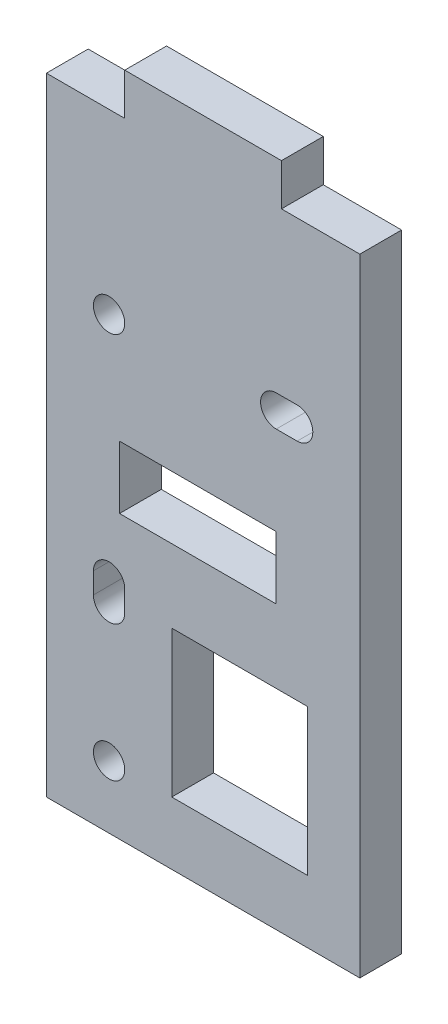
ISO-10303-21;
HEADER;
FILE_DESCRIPTION(('STEP AP214'),'2;1');
FILE_NAME('part.step','',(''),(''),'','','');
FILE_SCHEMA(('AUTOMOTIVE_DESIGN { 1 0 10303 214 1 1 1 1 }'));
ENDSEC;
DATA;
#1=APPLICATION_CONTEXT('core data for automotive mechanical design processes');
#2=APPLICATION_PROTOCOL_DEFINITION('international standard','automotive_design',2000,#1);
#3=PRODUCT_CONTEXT('',#1,'mechanical');
#4=PRODUCT('Part','Part','',(#3));
#5=PRODUCT_RELATED_PRODUCT_CATEGORY('part','',(#4));
#6=PRODUCT_DEFINITION_FORMATION('','',#4);
#7=PRODUCT_DEFINITION_CONTEXT('part definition',#1,'design');
#8=PRODUCT_DEFINITION('design','',#6,#7);
#9=PRODUCT_DEFINITION_SHAPE('','',#8);
#10=(LENGTH_UNIT() NAMED_UNIT(*) SI_UNIT(.MILLI.,.METRE.));
#11=(NAMED_UNIT(*) PLANE_ANGLE_UNIT() SI_UNIT($,.RADIAN.));
#12=(NAMED_UNIT(*) SI_UNIT($,.STERADIAN.) SOLID_ANGLE_UNIT());
#13=UNCERTAINTY_MEASURE_WITH_UNIT(LENGTH_MEASURE(1.E-05),#10,'distance_accuracy_value','');
#14=(GEOMETRIC_REPRESENTATION_CONTEXT(3) GLOBAL_UNCERTAINTY_ASSIGNED_CONTEXT((#13)) GLOBAL_UNIT_ASSIGNED_CONTEXT((#10,
#11,#12)) REPRESENTATION_CONTEXT('',''));
#15=CARTESIAN_POINT('',(0.,0.,0.));
#16=DIRECTION('',(0.,0.,1.));
#17=DIRECTION('',(1.,0.,0.));
#18=AXIS2_PLACEMENT_3D('',#15,#16,#17);
#19=CARTESIAN_POINT('',(0.,0.,4.));
#20=DIRECTION('',(0.,0.,-1.));
#21=DIRECTION('',(-1.,0.,0.));
#22=AXIS2_PLACEMENT_3D('',#19,#20,#21);
#23=PLANE('',#22);
#24=CARTESIAN_POINT('',(6.,21.,4.));
#25=DIRECTION('',(0.,0.,1.));
#26=DIRECTION('',(1.,0.,0.));
#27=AXIS2_PLACEMENT_3D('',#24,#25,#26);
#28=CIRCLE('',#27,1.5);
#29=CARTESIAN_POINT('',(7.5,21.,4.));
#30=VERTEX_POINT('',#29);
#31=CARTESIAN_POINT('',(4.5,21.,4.));
#32=VERTEX_POINT('',#31);
#33=EDGE_CURVE('E255',#30,#32,#28,.T.);
#34=ORIENTED_EDGE('',*,*,#33,.F.);
#35=DIRECTION('',(0.,1.,0.));
#36=VECTOR('',#35,1.);
#37=CARTESIAN_POINT('',(7.5,21.,4.));
#38=LINE('',#37,#36);
#39=CARTESIAN_POINT('',(7.5,19.,4.));
#40=VERTEX_POINT('',#39);
#41=EDGE_CURVE('E266',#40,#30,#38,.T.);
#42=ORIENTED_EDGE('',*,*,#41,.F.);
#43=CARTESIAN_POINT('',(6.,19.,4.));
#44=DIRECTION('',(0.,0.,1.));
#45=DIRECTION('',(1.,0.,0.));
#46=AXIS2_PLACEMENT_3D('',#43,#44,#45);
#47=CIRCLE('',#46,1.5);
#48=CARTESIAN_POINT('',(4.5,19.,4.));
#49=VERTEX_POINT('',#48);
#50=EDGE_CURVE('E262',#49,#40,#47,.T.);
#51=ORIENTED_EDGE('',*,*,#50,.F.);
#52=DIRECTION('',(0.,-1.,0.));
#53=VECTOR('',#52,1.);
#54=CARTESIAN_POINT('',(4.5,21.,4.));
#55=LINE('',#54,#53);
#56=EDGE_CURVE('E258',#32,#49,#55,.T.);
#57=ORIENTED_EDGE('',*,*,#56,.F.);
#58=EDGE_LOOP('',(#34,#42,#51,#57));
#59=FACE_BOUND('',#58,.T.);
#60=CARTESIAN_POINT('',(6.,43.,4.));
#61=DIRECTION('',(0.,0.,1.));
#62=DIRECTION('',(1.,0.,0.));
#63=AXIS2_PLACEMENT_3D('',#60,#61,#62);
#64=CIRCLE('',#63,1.5);
#65=CARTESIAN_POINT('',(7.5,43.,4.));
#66=VERTEX_POINT('',#65);
#67=EDGE_CURVE('E341',#66,#66,#64,.T.);
#68=ORIENTED_EDGE('',*,*,#67,.F.);
#69=EDGE_LOOP('',(#68));
#70=FACE_BOUND('',#69,.T.);
#71=CARTESIAN_POINT('',(6.,6.,4.));
#72=DIRECTION('',(0.,0.,1.));
#73=DIRECTION('',(1.,0.,0.));
#74=AXIS2_PLACEMENT_3D('',#71,#72,#73);
#75=CIRCLE('',#74,1.5);
#76=CARTESIAN_POINT('',(7.5,6.,4.));
#77=VERTEX_POINT('',#76);
#78=EDGE_CURVE('E349',#77,#77,#75,.T.);
#79=ORIENTED_EDGE('',*,*,#78,.F.);
#80=EDGE_LOOP('',(#79));
#81=FACE_BOUND('',#80,.T.);
#82=DIRECTION('',(0.,-1.,0.));
#83=VECTOR('',#82,1.);
#84=CARTESIAN_POINT('',(12.,20.,4.));
#85=LINE('',#84,#83);
#86=CARTESIAN_POINT('',(12.,20.,4.));
#87=VERTEX_POINT('',#86);
#88=CARTESIAN_POINT('',(12.,6.,4.));
#89=VERTEX_POINT('',#88);
#90=EDGE_CURVE('E357',#87,#89,#85,.T.);
#91=ORIENTED_EDGE('',*,*,#90,.F.);
#92=DIRECTION('',(-1.,0.,0.));
#93=VECTOR('',#92,1.);
#94=CARTESIAN_POINT('',(12.,20.,4.));
#95=LINE('',#94,#93);
#96=CARTESIAN_POINT('',(25.,20.,4.));
#97=VERTEX_POINT('',#96);
#98=EDGE_CURVE('E368',#97,#87,#95,.T.);
#99=ORIENTED_EDGE('',*,*,#98,.F.);
#100=DIRECTION('',(0.,1.,0.));
#101=VECTOR('',#100,1.);
#102=CARTESIAN_POINT('',(25.,20.,4.));
#103=LINE('',#102,#101);
#104=CARTESIAN_POINT('',(25.,6.,4.));
#105=VERTEX_POINT('',#104);
#106=EDGE_CURVE('E364',#105,#97,#103,.T.);
#107=ORIENTED_EDGE('',*,*,#106,.F.);
#108=DIRECTION('',(1.,0.,0.));
#109=VECTOR('',#108,1.);
#110=CARTESIAN_POINT('',(12.,6.,4.));
#111=LINE('',#110,#109);
#112=EDGE_CURVE('E360',#89,#105,#111,.T.);
#113=ORIENTED_EDGE('',*,*,#112,.F.);
#114=EDGE_LOOP('',(#91,#99,#107,#113));
#115=FACE_BOUND('',#114,.T.);
#116=DIRECTION('',(0.,-1.,0.));
#117=VECTOR('',#116,1.);
#118=CARTESIAN_POINT('',(0.,0.,4.));
#119=LINE('',#118,#117);
#120=CARTESIAN_POINT('',(0.,60.,4.));
#121=VERTEX_POINT('',#120);
#122=CARTESIAN_POINT('',(0.,0.,4.));
#123=VERTEX_POINT('',#122);
#124=EDGE_CURVE('E400',#121,#123,#119,.T.);
#125=ORIENTED_EDGE('',*,*,#124,.T.);
#126=DIRECTION('',(1.,0.,0.));
#127=VECTOR('',#126,1.);
#128=CARTESIAN_POINT('',(0.,0.,4.));
#129=LINE('',#128,#127);
#130=CARTESIAN_POINT('',(30.,0.,4.));
#131=VERTEX_POINT('',#130);
#132=EDGE_CURVE('E404',#123,#131,#129,.T.);
#133=ORIENTED_EDGE('',*,*,#132,.T.);
#134=DIRECTION('',(0.,1.,0.));
#135=VECTOR('',#134,1.);
#136=CARTESIAN_POINT('',(30.,0.,4.));
#137=LINE('',#136,#135);
#138=CARTESIAN_POINT('',(30.,60.,4.));
#139=VERTEX_POINT('',#138);
#140=EDGE_CURVE('E408',#131,#139,#137,.T.);
#141=ORIENTED_EDGE('',*,*,#140,.T.);
#142=DIRECTION('',(-1.,0.,0.));
#143=VECTOR('',#142,1.);
#144=CARTESIAN_POINT('',(22.5,60.,4.));
#145=LINE('',#144,#143);
#146=CARTESIAN_POINT('',(22.5,60.,4.));
#147=VERTEX_POINT('',#146);
#148=EDGE_CURVE('E411',#139,#147,#145,.T.);
#149=ORIENTED_EDGE('',*,*,#148,.T.);
#150=DIRECTION('',(0.,1.,0.));
#151=VECTOR('',#150,1.);
#152=CARTESIAN_POINT('',(22.5,60.,4.));
#153=LINE('',#152,#151);
#154=CARTESIAN_POINT('',(22.5,64.,4.));
#155=VERTEX_POINT('',#154);
#156=EDGE_CURVE('E414',#147,#155,#153,.T.);
#157=ORIENTED_EDGE('',*,*,#156,.T.);
#158=DIRECTION('',(-1.,0.,0.));
#159=VECTOR('',#158,1.);
#160=CARTESIAN_POINT('',(7.5,64.,4.));
#161=LINE('',#160,#159);
#162=CARTESIAN_POINT('',(7.5,64.,4.));
#163=VERTEX_POINT('',#162);
#164=EDGE_CURVE('E417',#155,#163,#161,.T.);
#165=ORIENTED_EDGE('',*,*,#164,.T.);
#166=DIRECTION('',(0.,-1.,0.));
#167=VECTOR('',#166,1.);
#168=CARTESIAN_POINT('',(7.5,60.,4.));
#169=LINE('',#168,#167);
#170=CARTESIAN_POINT('',(7.5,60.,4.));
#171=VERTEX_POINT('',#170);
#172=EDGE_CURVE('E420',#163,#171,#169,.T.);
#173=ORIENTED_EDGE('',*,*,#172,.T.);
#174=DIRECTION('',(-1.,0.,0.));
#175=VECTOR('',#174,1.);
#176=CARTESIAN_POINT('',(0.,60.,4.));
#177=LINE('',#176,#175);
#178=EDGE_CURVE('E423',#171,#121,#177,.T.);
#179=ORIENTED_EDGE('',*,*,#178,.T.);
#180=EDGE_LOOP('',(#125,#133,#141,#149,#157,#165,#173,#179));
#181=FACE_BOUND('',#180,.T.);
#182=DIRECTION('',(0.,-1.,0.));
#183=VECTOR('',#182,1.);
#184=CARTESIAN_POINT('',(7.,33.,4.));
#185=LINE('',#184,#183);
#186=CARTESIAN_POINT('',(7.,33.,4.));
#187=VERTEX_POINT('',#186);
#188=CARTESIAN_POINT('',(7.,27.,4.));
#189=VERTEX_POINT('',#188);
#190=EDGE_CURVE('E298',#187,#189,#185,.T.);
#191=ORIENTED_EDGE('',*,*,#190,.F.);
#192=DIRECTION('',(-1.,0.,0.));
#193=VECTOR('',#192,1.);
#194=CARTESIAN_POINT('',(7.,33.,4.));
#195=LINE('',#194,#193);
#196=CARTESIAN_POINT('',(22.,33.,4.));
#197=VERTEX_POINT('',#196);
#198=EDGE_CURVE('E309',#197,#187,#195,.T.);
#199=ORIENTED_EDGE('',*,*,#198,.F.);
#200=DIRECTION('',(0.,1.,0.));
#201=VECTOR('',#200,1.);
#202=CARTESIAN_POINT('',(22.,33.,4.));
#203=LINE('',#202,#201);
#204=CARTESIAN_POINT('',(22.,27.,4.));
#205=VERTEX_POINT('',#204);
#206=EDGE_CURVE('E305',#205,#197,#203,.T.);
#207=ORIENTED_EDGE('',*,*,#206,.F.);
#208=DIRECTION('',(1.,0.,0.));
#209=VECTOR('',#208,1.);
#210=CARTESIAN_POINT('',(7.,27.,4.));
#211=LINE('',#210,#209);
#212=EDGE_CURVE('E301',#189,#205,#211,.T.);
#213=ORIENTED_EDGE('',*,*,#212,.F.);
#214=EDGE_LOOP('',(#191,#199,#207,#213));
#215=FACE_BOUND('',#214,.T.);
#216=CARTESIAN_POINT('',(22.,43.,4.));
#217=DIRECTION('',(0.,0.,1.));
#218=DIRECTION('',(1.,0.,0.));
#219=AXIS2_PLACEMENT_3D('',#216,#217,#218);
#220=CIRCLE('',#219,1.5);
#221=CARTESIAN_POINT('',(22.,44.5,4.));
#222=VERTEX_POINT('',#221);
#223=CARTESIAN_POINT('',(22.,41.5,4.));
#224=VERTEX_POINT('',#223);
#225=EDGE_CURVE('E207',#222,#224,#220,.T.);
#226=ORIENTED_EDGE('',*,*,#225,.F.);
#227=DIRECTION('',(-1.,0.,0.));
#228=VECTOR('',#227,1.);
#229=CARTESIAN_POINT('',(22.,44.5,4.));
#230=LINE('',#229,#228);
#231=CARTESIAN_POINT('',(24.,44.5,4.));
#232=VERTEX_POINT('',#231);
#233=EDGE_CURVE('E233',#232,#222,#230,.T.);
#234=ORIENTED_EDGE('',*,*,#233,.F.);
#235=CARTESIAN_POINT('',(24.,43.,4.));
#236=DIRECTION('',(0.,0.,1.));
#237=DIRECTION('',(1.,0.,0.));
#238=AXIS2_PLACEMENT_3D('',#235,#236,#237);
#239=CIRCLE('',#238,1.5);
#240=CARTESIAN_POINT('',(24.,41.5,4.));
#241=VERTEX_POINT('',#240);
#242=EDGE_CURVE('E229',#241,#232,#239,.T.);
#243=ORIENTED_EDGE('',*,*,#242,.F.);
#244=DIRECTION('',(1.,0.,0.));
#245=VECTOR('',#244,1.);
#246=CARTESIAN_POINT('',(22.,41.5,4.));
#247=LINE('',#246,#245);
#248=EDGE_CURVE('E216',#224,#241,#247,.T.);
#249=ORIENTED_EDGE('',*,*,#248,.F.);
#250=EDGE_LOOP('',(#226,#234,#243,#249));
#251=FACE_BOUND('',#250,.T.);
#252=ADVANCED_FACE('F45',(#59,#70,#81,#115,#181,#215,#251),#23,.F.);
#253=CARTESIAN_POINT('',(0.,0.,0.));
#254=DIRECTION('',(0.,0.,-1.));
#255=DIRECTION('',(-1.,0.,0.));
#256=AXIS2_PLACEMENT_3D('',#253,#254,#255);
#257=PLANE('',#256);
#258=CARTESIAN_POINT('',(6.,6.,0.));
#259=DIRECTION('',(0.,0.,1.));
#260=DIRECTION('',(1.,0.,0.));
#261=AXIS2_PLACEMENT_3D('',#258,#259,#260);
#262=CIRCLE('',#261,1.5);
#263=CARTESIAN_POINT('',(7.5,6.,0.));
#264=VERTEX_POINT('',#263);
#265=EDGE_CURVE('E345',#264,#264,#262,.T.);
#266=ORIENTED_EDGE('',*,*,#265,.T.);
#267=EDGE_LOOP('',(#266));
#268=FACE_BOUND('',#267,.T.);
#269=DIRECTION('',(0.,-1.,0.));
#270=VECTOR('',#269,1.);
#271=CARTESIAN_POINT('',(0.,0.,0.));
#272=LINE('',#271,#270);
#273=CARTESIAN_POINT('',(0.,60.,0.));
#274=VERTEX_POINT('',#273);
#275=CARTESIAN_POINT('',(0.,0.,0.));
#276=VERTEX_POINT('',#275);
#277=EDGE_CURVE('E399',#274,#276,#272,.T.);
#278=ORIENTED_EDGE('',*,*,#277,.F.);
#279=DIRECTION('',(-1.,0.,0.));
#280=VECTOR('',#279,1.);
#281=CARTESIAN_POINT('',(0.,60.,0.));
#282=LINE('',#281,#280);
#283=CARTESIAN_POINT('',(7.5,60.,0.));
#284=VERTEX_POINT('',#283);
#285=EDGE_CURVE('E405',#284,#274,#282,.T.);
#286=ORIENTED_EDGE('',*,*,#285,.F.);
#287=DIRECTION('',(0.,-1.,0.));
#288=VECTOR('',#287,1.);
#289=CARTESIAN_POINT('',(7.5,60.,0.));
#290=LINE('',#289,#288);
#291=CARTESIAN_POINT('',(7.5,64.,0.));
#292=VERTEX_POINT('',#291);
#293=EDGE_CURVE('E445',#292,#284,#290,.T.);
#294=ORIENTED_EDGE('',*,*,#293,.F.);
#295=DIRECTION('',(-1.,0.,0.));
#296=VECTOR('',#295,1.);
#297=CARTESIAN_POINT('',(7.5,64.,0.));
#298=LINE('',#297,#296);
#299=CARTESIAN_POINT('',(22.5,64.,0.));
#300=VERTEX_POINT('',#299);
#301=EDGE_CURVE('E442',#300,#292,#298,.T.);
#302=ORIENTED_EDGE('',*,*,#301,.F.);
#303=DIRECTION('',(0.,1.,0.));
#304=VECTOR('',#303,1.);
#305=CARTESIAN_POINT('',(22.5,60.,0.));
#306=LINE('',#305,#304);
#307=CARTESIAN_POINT('',(22.5,60.,0.));
#308=VERTEX_POINT('',#307);
#309=EDGE_CURVE('E439',#308,#300,#306,.T.);
#310=ORIENTED_EDGE('',*,*,#309,.F.);
#311=DIRECTION('',(-1.,0.,0.));
#312=VECTOR('',#311,1.);
#313=CARTESIAN_POINT('',(22.5,60.,0.));
#314=LINE('',#313,#312);
#315=CARTESIAN_POINT('',(30.,60.,0.));
#316=VERTEX_POINT('',#315);
#317=EDGE_CURVE('E436',#316,#308,#314,.T.);
#318=ORIENTED_EDGE('',*,*,#317,.F.);
#319=DIRECTION('',(0.,1.,0.));
#320=VECTOR('',#319,1.);
#321=CARTESIAN_POINT('',(30.,0.,0.));
#322=LINE('',#321,#320);
#323=CARTESIAN_POINT('',(30.,0.,0.));
#324=VERTEX_POINT('',#323);
#325=EDGE_CURVE('E433',#324,#316,#322,.T.);
#326=ORIENTED_EDGE('',*,*,#325,.F.);
#327=DIRECTION('',(1.,0.,0.));
#328=VECTOR('',#327,1.);
#329=CARTESIAN_POINT('',(0.,0.,0.));
#330=LINE('',#329,#328);
#331=EDGE_CURVE('E430',#276,#324,#330,.T.);
#332=ORIENTED_EDGE('',*,*,#331,.F.);
#333=EDGE_LOOP('',(#278,#286,#294,#302,#310,#318,#326,#332));
#334=FACE_BOUND('',#333,.T.);
#335=DIRECTION('',(-1.,0.,0.));
#336=VECTOR('',#335,1.);
#337=CARTESIAN_POINT('',(12.,20.,0.));
#338=LINE('',#337,#336);
#339=CARTESIAN_POINT('',(25.,20.,0.));
#340=VERTEX_POINT('',#339);
#341=CARTESIAN_POINT('',(12.,20.,0.));
#342=VERTEX_POINT('',#341);
#343=EDGE_CURVE('E361',#340,#342,#338,.T.);
#344=ORIENTED_EDGE('',*,*,#343,.T.);
#345=DIRECTION('',(0.,-1.,0.));
#346=VECTOR('',#345,1.);
#347=CARTESIAN_POINT('',(12.,20.,0.));
#348=LINE('',#347,#346);
#349=CARTESIAN_POINT('',(12.,6.,0.));
#350=VERTEX_POINT('',#349);
#351=EDGE_CURVE('E353',#342,#350,#348,.T.);
#352=ORIENTED_EDGE('',*,*,#351,.T.);
#353=DIRECTION('',(1.,0.,0.));
#354=VECTOR('',#353,1.);
#355=CARTESIAN_POINT('',(12.,6.,0.));
#356=LINE('',#355,#354);
#357=CARTESIAN_POINT('',(25.,6.,0.));
#358=VERTEX_POINT('',#357);
#359=EDGE_CURVE('E375',#350,#358,#356,.T.);
#360=ORIENTED_EDGE('',*,*,#359,.T.);
#361=DIRECTION('',(0.,1.,0.));
#362=VECTOR('',#361,1.);
#363=CARTESIAN_POINT('',(25.,20.,0.));
#364=LINE('',#363,#362);
#365=EDGE_CURVE('E379',#358,#340,#364,.T.);
#366=ORIENTED_EDGE('',*,*,#365,.T.);
#367=EDGE_LOOP('',(#344,#352,#360,#366));
#368=FACE_BOUND('',#367,.T.);
#369=CARTESIAN_POINT('',(6.,43.,0.));
#370=DIRECTION('',(0.,0.,1.));
#371=DIRECTION('',(1.,0.,0.));
#372=AXIS2_PLACEMENT_3D('',#369,#370,#371);
#373=CIRCLE('',#372,1.5);
#374=CARTESIAN_POINT('',(7.5,43.,0.));
#375=VERTEX_POINT('',#374);
#376=EDGE_CURVE('E340',#375,#375,#373,.T.);
#377=ORIENTED_EDGE('',*,*,#376,.T.);
#378=EDGE_LOOP('',(#377));
#379=FACE_BOUND('',#378,.T.);
#380=DIRECTION('',(-1.,0.,0.));
#381=VECTOR('',#380,1.);
#382=CARTESIAN_POINT('',(7.,33.,0.));
#383=LINE('',#382,#381);
#384=CARTESIAN_POINT('',(22.,33.,0.));
#385=VERTEX_POINT('',#384);
#386=CARTESIAN_POINT('',(7.,33.,0.));
#387=VERTEX_POINT('',#386);
#388=EDGE_CURVE('E302',#385,#387,#383,.T.);
#389=ORIENTED_EDGE('',*,*,#388,.T.);
#390=DIRECTION('',(0.,-1.,0.));
#391=VECTOR('',#390,1.);
#392=CARTESIAN_POINT('',(7.,33.,0.));
#393=LINE('',#392,#391);
#394=CARTESIAN_POINT('',(7.,27.,0.));
#395=VERTEX_POINT('',#394);
#396=EDGE_CURVE('E297',#387,#395,#393,.T.);
#397=ORIENTED_EDGE('',*,*,#396,.T.);
#398=DIRECTION('',(1.,0.,0.));
#399=VECTOR('',#398,1.);
#400=CARTESIAN_POINT('',(7.,27.,0.));
#401=LINE('',#400,#399);
#402=CARTESIAN_POINT('',(22.,27.,0.));
#403=VERTEX_POINT('',#402);
#404=EDGE_CURVE('E316',#395,#403,#401,.T.);
#405=ORIENTED_EDGE('',*,*,#404,.T.);
#406=DIRECTION('',(0.,1.,0.));
#407=VECTOR('',#406,1.);
#408=CARTESIAN_POINT('',(22.,33.,0.));
#409=LINE('',#408,#407);
#410=EDGE_CURVE('E320',#403,#385,#409,.T.);
#411=ORIENTED_EDGE('',*,*,#410,.T.);
#412=EDGE_LOOP('',(#389,#397,#405,#411));
#413=FACE_BOUND('',#412,.T.);
#414=DIRECTION('',(0.,1.,0.));
#415=VECTOR('',#414,1.);
#416=CARTESIAN_POINT('',(7.5,21.,0.));
#417=LINE('',#416,#415);
#418=CARTESIAN_POINT('',(7.5,19.,0.));
#419=VERTEX_POINT('',#418);
#420=CARTESIAN_POINT('',(7.5,21.,0.));
#421=VERTEX_POINT('',#420);
#422=EDGE_CURVE('E259',#419,#421,#417,.T.);
#423=ORIENTED_EDGE('',*,*,#422,.T.);
#424=CARTESIAN_POINT('',(6.,21.,0.));
#425=DIRECTION('',(0.,0.,1.));
#426=DIRECTION('',(1.,0.,0.));
#427=AXIS2_PLACEMENT_3D('',#424,#425,#426);
#428=CIRCLE('',#427,1.5);
#429=CARTESIAN_POINT('',(4.5,21.,0.));
#430=VERTEX_POINT('',#429);
#431=EDGE_CURVE('E225',#421,#430,#428,.T.);
#432=ORIENTED_EDGE('',*,*,#431,.T.);
#433=DIRECTION('',(0.,-1.,0.));
#434=VECTOR('',#433,1.);
#435=CARTESIAN_POINT('',(4.5,21.,0.));
#436=LINE('',#435,#434);
#437=CARTESIAN_POINT('',(4.5,19.,0.));
#438=VERTEX_POINT('',#437);
#439=EDGE_CURVE('E273',#430,#438,#436,.T.);
#440=ORIENTED_EDGE('',*,*,#439,.T.);
#441=CARTESIAN_POINT('',(6.,19.,0.));
#442=DIRECTION('',(0.,0.,1.));
#443=DIRECTION('',(1.,0.,0.));
#444=AXIS2_PLACEMENT_3D('',#441,#442,#443);
#445=CIRCLE('',#444,1.5);
#446=EDGE_CURVE('E277',#438,#419,#445,.T.);
#447=ORIENTED_EDGE('',*,*,#446,.T.);
#448=EDGE_LOOP('',(#423,#432,#440,#447));
#449=FACE_BOUND('',#448,.T.);
#450=DIRECTION('',(-1.,0.,0.));
#451=VECTOR('',#450,1.);
#452=CARTESIAN_POINT('',(22.,44.5,0.));
#453=LINE('',#452,#451);
#454=CARTESIAN_POINT('',(24.,44.5,0.));
#455=VERTEX_POINT('',#454);
#456=CARTESIAN_POINT('',(22.,44.5,0.));
#457=VERTEX_POINT('',#456);
#458=EDGE_CURVE('E217',#455,#457,#453,.T.);
#459=ORIENTED_EDGE('',*,*,#458,.T.);
#460=CARTESIAN_POINT('',(22.,43.,0.));
#461=DIRECTION('',(0.,0.,1.));
#462=DIRECTION('',(1.,0.,0.));
#463=AXIS2_PLACEMENT_3D('',#460,#461,#462);
#464=CIRCLE('',#463,1.5);
#465=CARTESIAN_POINT('',(22.,41.5,0.));
#466=VERTEX_POINT('',#465);
#467=EDGE_CURVE('E69',#457,#466,#464,.T.);
#468=ORIENTED_EDGE('',*,*,#467,.T.);
#469=DIRECTION('',(1.,0.,0.));
#470=VECTOR('',#469,1.);
#471=CARTESIAN_POINT('',(22.,41.5,0.));
#472=LINE('',#471,#470);
#473=CARTESIAN_POINT('',(24.,41.5,0.));
#474=VERTEX_POINT('',#473);
#475=EDGE_CURVE('E223',#466,#474,#472,.T.);
#476=ORIENTED_EDGE('',*,*,#475,.T.);
#477=CARTESIAN_POINT('',(24.,43.,0.));
#478=DIRECTION('',(0.,0.,1.));
#479=DIRECTION('',(1.,0.,0.));
#480=AXIS2_PLACEMENT_3D('',#477,#478,#479);
#481=CIRCLE('',#480,1.5);
#482=EDGE_CURVE('E242',#474,#455,#481,.T.);
#483=ORIENTED_EDGE('',*,*,#482,.T.);
#484=EDGE_LOOP('',(#459,#468,#476,#483));
#485=FACE_BOUND('',#484,.T.);
#486=ADVANCED_FACE('F484',(#268,#334,#368,#379,#413,#449,#485),#257,.T.);
#487=CARTESIAN_POINT('',(0.,0.,4.));
#488=DIRECTION('',(1.,0.,0.));
#489=DIRECTION('',(0.,0.,-1.));
#490=AXIS2_PLACEMENT_3D('',#487,#488,#489);
#491=PLANE('',#490);
#492=ORIENTED_EDGE('',*,*,#277,.T.);
#493=DIRECTION('',(0.,0.,-1.));
#494=VECTOR('',#493,1.);
#495=CARTESIAN_POINT('',(0.,0.,4.));
#496=LINE('',#495,#494);
#497=EDGE_CURVE('E11',#123,#276,#496,.T.);
#498=ORIENTED_EDGE('',*,*,#497,.F.);
#499=ORIENTED_EDGE('',*,*,#124,.F.);
#500=DIRECTION('',(0.,0.,-1.));
#501=VECTOR('',#500,1.);
#502=CARTESIAN_POINT('',(0.,60.,4.));
#503=LINE('',#502,#501);
#504=EDGE_CURVE('E426',#121,#274,#503,.T.);
#505=ORIENTED_EDGE('',*,*,#504,.T.);
#506=EDGE_LOOP('',(#492,#498,#499,#505));
#507=FACE_BOUND('',#506,.T.);
#508=ADVANCED_FACE('F47',(#507),#491,.F.);
#509=CARTESIAN_POINT('',(0.,0.,4.));
#510=DIRECTION('',(0.,1.,0.));
#511=DIRECTION('',(0.,0.,1.));
#512=AXIS2_PLACEMENT_3D('',#509,#510,#511);
#513=PLANE('',#512);
#514=ORIENTED_EDGE('',*,*,#331,.T.);
#515=DIRECTION('',(0.,0.,-1.));
#516=VECTOR('',#515,1.);
#517=CARTESIAN_POINT('',(30.,0.,4.));
#518=LINE('',#517,#516);
#519=EDGE_CURVE('E54',#131,#324,#518,.T.);
#520=ORIENTED_EDGE('',*,*,#519,.F.);
#521=ORIENTED_EDGE('',*,*,#132,.F.);
#522=ORIENTED_EDGE('',*,*,#497,.T.);
#523=EDGE_LOOP('',(#514,#520,#521,#522));
#524=FACE_BOUND('',#523,.T.);
#525=ADVANCED_FACE('F502',(#524),#513,.F.);
#526=CARTESIAN_POINT('',(30.,0.,4.));
#527=DIRECTION('',(-1.,0.,0.));
#528=DIRECTION('',(0.,0.,1.));
#529=AXIS2_PLACEMENT_3D('',#526,#527,#528);
#530=PLANE('',#529);
#531=ORIENTED_EDGE('',*,*,#325,.T.);
#532=DIRECTION('',(0.,0.,-1.));
#533=VECTOR('',#532,1.);
#534=CARTESIAN_POINT('',(30.,60.,4.));
#535=LINE('',#534,#533);
#536=EDGE_CURVE('E469',#139,#316,#535,.T.);
#537=ORIENTED_EDGE('',*,*,#536,.F.);
#538=ORIENTED_EDGE('',*,*,#140,.F.);
#539=ORIENTED_EDGE('',*,*,#519,.T.);
#540=EDGE_LOOP('',(#531,#537,#538,#539));
#541=FACE_BOUND('',#540,.T.);
#542=ADVANCED_FACE('F478',(#541),#530,.F.);
#543=CARTESIAN_POINT('',(22.5,60.,4.));
#544=DIRECTION('',(0.,-1.,0.));
#545=DIRECTION('',(0.,0.,-1.));
#546=AXIS2_PLACEMENT_3D('',#543,#544,#545);
#547=PLANE('',#546);
#548=ORIENTED_EDGE('',*,*,#317,.T.);
#549=DIRECTION('',(0.,0.,-1.));
#550=VECTOR('',#549,1.);
#551=CARTESIAN_POINT('',(22.5,60.,4.));
#552=LINE('',#551,#550);
#553=EDGE_CURVE('E465',#147,#308,#552,.T.);
#554=ORIENTED_EDGE('',*,*,#553,.F.);
#555=ORIENTED_EDGE('',*,*,#148,.F.);
#556=ORIENTED_EDGE('',*,*,#536,.T.);
#557=EDGE_LOOP('',(#548,#554,#555,#556));
#558=FACE_BOUND('',#557,.T.);
#559=ADVANCED_FACE('F490',(#558),#547,.F.);
#560=CARTESIAN_POINT('',(22.5,60.,4.));
#561=DIRECTION('',(-1.,0.,0.));
#562=DIRECTION('',(0.,0.,1.));
#563=AXIS2_PLACEMENT_3D('',#560,#561,#562);
#564=PLANE('',#563);
#565=ORIENTED_EDGE('',*,*,#309,.T.);
#566=DIRECTION('',(0.,0.,-1.));
#567=VECTOR('',#566,1.);
#568=CARTESIAN_POINT('',(22.5,64.,4.));
#569=LINE('',#568,#567);
#570=EDGE_CURVE('E461',#155,#300,#569,.T.);
#571=ORIENTED_EDGE('',*,*,#570,.F.);
#572=ORIENTED_EDGE('',*,*,#156,.F.);
#573=ORIENTED_EDGE('',*,*,#553,.T.);
#574=EDGE_LOOP('',(#565,#571,#572,#573));
#575=FACE_BOUND('',#574,.T.);
#576=ADVANCED_FACE('F494',(#575),#564,.F.);
#577=CARTESIAN_POINT('',(7.5,64.,4.));
#578=DIRECTION('',(0.,-1.,0.));
#579=DIRECTION('',(0.,0.,-1.));
#580=AXIS2_PLACEMENT_3D('',#577,#578,#579);
#581=PLANE('',#580);
#582=ORIENTED_EDGE('',*,*,#301,.T.);
#583=DIRECTION('',(0.,0.,-1.));
#584=VECTOR('',#583,1.);
#585=CARTESIAN_POINT('',(7.5,64.,4.));
#586=LINE('',#585,#584);
#587=EDGE_CURVE('E457',#163,#292,#586,.T.);
#588=ORIENTED_EDGE('',*,*,#587,.F.);
#589=ORIENTED_EDGE('',*,*,#164,.F.);
#590=ORIENTED_EDGE('',*,*,#570,.T.);
#591=EDGE_LOOP('',(#582,#588,#589,#590));
#592=FACE_BOUND('',#591,.T.);
#593=ADVANCED_FACE('F515',(#592),#581,.F.);
#594=CARTESIAN_POINT('',(7.5,60.,4.));
#595=DIRECTION('',(1.,0.,0.));
#596=DIRECTION('',(0.,0.,-1.));
#597=AXIS2_PLACEMENT_3D('',#594,#595,#596);
#598=PLANE('',#597);
#599=ORIENTED_EDGE('',*,*,#293,.T.);
#600=DIRECTION('',(0.,0.,-1.));
#601=VECTOR('',#600,1.);
#602=CARTESIAN_POINT('',(7.5,60.,4.));
#603=LINE('',#602,#601);
#604=EDGE_CURVE('E453',#171,#284,#603,.T.);
#605=ORIENTED_EDGE('',*,*,#604,.F.);
#606=ORIENTED_EDGE('',*,*,#172,.F.);
#607=ORIENTED_EDGE('',*,*,#587,.T.);
#608=EDGE_LOOP('',(#599,#605,#606,#607));
#609=FACE_BOUND('',#608,.T.);
#610=ADVANCED_FACE('F513',(#609),#598,.F.);
#611=CARTESIAN_POINT('',(0.,60.,4.));
#612=DIRECTION('',(0.,-1.,0.));
#613=DIRECTION('',(0.,0.,-1.));
#614=AXIS2_PLACEMENT_3D('',#611,#612,#613);
#615=PLANE('',#614);
#616=ORIENTED_EDGE('',*,*,#285,.T.);
#617=ORIENTED_EDGE('',*,*,#504,.F.);
#618=ORIENTED_EDGE('',*,*,#178,.F.);
#619=ORIENTED_EDGE('',*,*,#604,.T.);
#620=EDGE_LOOP('',(#616,#617,#618,#619));
#621=FACE_BOUND('',#620,.T.);
#622=ADVANCED_FACE('F508',(#621),#615,.F.);
#623=CARTESIAN_POINT('',(12.,20.,4.));
#624=DIRECTION('',(1.,0.,0.));
#625=DIRECTION('',(0.,1.,0.));
#626=AXIS2_PLACEMENT_3D('',#623,#624,#625);
#627=PLANE('',#626);
#628=ORIENTED_EDGE('',*,*,#351,.F.);
#629=DIRECTION('',(0.,0.,-1.));
#630=VECTOR('',#629,1.);
#631=CARTESIAN_POINT('',(12.,20.,4.));
#632=LINE('',#631,#630);
#633=EDGE_CURVE('E371',#87,#342,#632,.T.);
#634=ORIENTED_EDGE('',*,*,#633,.F.);
#635=ORIENTED_EDGE('',*,*,#90,.T.);
#636=DIRECTION('',(0.,0.,-1.));
#637=VECTOR('',#636,1.);
#638=CARTESIAN_POINT('',(12.,6.,4.));
#639=LINE('',#638,#637);
#640=EDGE_CURVE('E395',#89,#350,#639,.T.);
#641=ORIENTED_EDGE('',*,*,#640,.T.);
#642=EDGE_LOOP('',(#628,#634,#635,#641));
#643=FACE_BOUND('',#642,.T.);
#644=ADVANCED_FACE('F535',(#643),#627,.T.);
#645=CARTESIAN_POINT('',(12.,6.,4.));
#646=DIRECTION('',(0.,1.,0.));
#647=DIRECTION('',(-1.,0.,0.));
#648=AXIS2_PLACEMENT_3D('',#645,#646,#647);
#649=PLANE('',#648);
#650=ORIENTED_EDGE('',*,*,#359,.F.);
#651=ORIENTED_EDGE('',*,*,#640,.F.);
#652=ORIENTED_EDGE('',*,*,#112,.T.);
#653=DIRECTION('',(0.,0.,-1.));
#654=VECTOR('',#653,1.);
#655=CARTESIAN_POINT('',(25.,6.,4.));
#656=LINE('',#655,#654);
#657=EDGE_CURVE('E392',#105,#358,#656,.T.);
#658=ORIENTED_EDGE('',*,*,#657,.T.);
#659=EDGE_LOOP('',(#650,#651,#652,#658));
#660=FACE_BOUND('',#659,.T.);
#661=ADVANCED_FACE('F542',(#660),#649,.T.);
#662=CARTESIAN_POINT('',(25.,20.,4.));
#663=DIRECTION('',(-1.,0.,0.));
#664=DIRECTION('',(0.,-1.,0.));
#665=AXIS2_PLACEMENT_3D('',#662,#663,#664);
#666=PLANE('',#665);
#667=ORIENTED_EDGE('',*,*,#365,.F.);
#668=ORIENTED_EDGE('',*,*,#657,.F.);
#669=ORIENTED_EDGE('',*,*,#106,.T.);
#670=DIRECTION('',(0.,0.,-1.));
#671=VECTOR('',#670,1.);
#672=CARTESIAN_POINT('',(25.,20.,4.));
#673=LINE('',#672,#671);
#674=EDGE_CURVE('E389',#97,#340,#673,.T.);
#675=ORIENTED_EDGE('',*,*,#674,.T.);
#676=EDGE_LOOP('',(#667,#668,#669,#675));
#677=FACE_BOUND('',#676,.T.);
#678=ADVANCED_FACE('F547',(#677),#666,.T.);
#679=CARTESIAN_POINT('',(12.,20.,4.));
#680=DIRECTION('',(0.,-1.,0.));
#681=DIRECTION('',(0.,0.,-1.));
#682=AXIS2_PLACEMENT_3D('',#679,#680,#681);
#683=PLANE('',#682);
#684=ORIENTED_EDGE('',*,*,#343,.F.);
#685=ORIENTED_EDGE('',*,*,#674,.F.);
#686=ORIENTED_EDGE('',*,*,#98,.T.);
#687=ORIENTED_EDGE('',*,*,#633,.T.);
#688=EDGE_LOOP('',(#684,#685,#686,#687));
#689=FACE_BOUND('',#688,.T.);
#690=ADVANCED_FACE('F554',(#689),#683,.T.);
#691=CARTESIAN_POINT('',(6.,6.,4.));
#692=DIRECTION('',(0.,0.,-1.));
#693=DIRECTION('',(-1.,0.,0.));
#694=AXIS2_PLACEMENT_3D('',#691,#692,#693);
#695=CYLINDRICAL_SURFACE('',#694,1.5);
#696=ORIENTED_EDGE('',*,*,#78,.T.);
#697=EDGE_LOOP('',(#696));
#698=FACE_BOUND('',#697,.T.);
#699=ORIENTED_EDGE('',*,*,#265,.F.);
#700=EDGE_LOOP('',(#699));
#701=FACE_BOUND('',#700,.T.);
#702=ADVANCED_FACE('F568',(#698,#701),#695,.F.);
#703=CARTESIAN_POINT('',(6.,43.,4.));
#704=DIRECTION('',(0.,0.,-1.));
#705=DIRECTION('',(-1.,0.,0.));
#706=AXIS2_PLACEMENT_3D('',#703,#704,#705);
#707=CYLINDRICAL_SURFACE('',#706,1.5);
#708=ORIENTED_EDGE('',*,*,#67,.T.);
#709=EDGE_LOOP('',(#708));
#710=FACE_BOUND('',#709,.T.);
#711=ORIENTED_EDGE('',*,*,#376,.F.);
#712=EDGE_LOOP('',(#711));
#713=FACE_BOUND('',#712,.T.);
#714=ADVANCED_FACE('F573',(#710,#713),#707,.F.);
#715=CARTESIAN_POINT('',(7.,33.,4.));
#716=DIRECTION('',(1.,0.,0.));
#717=DIRECTION('',(0.,1.,0.));
#718=AXIS2_PLACEMENT_3D('',#715,#716,#717);
#719=PLANE('',#718);
#720=ORIENTED_EDGE('',*,*,#396,.F.);
#721=DIRECTION('',(0.,0.,-1.));
#722=VECTOR('',#721,1.);
#723=CARTESIAN_POINT('',(7.,33.,4.));
#724=LINE('',#723,#722);
#725=EDGE_CURVE('E312',#187,#387,#724,.T.);
#726=ORIENTED_EDGE('',*,*,#725,.F.);
#727=ORIENTED_EDGE('',*,*,#190,.T.);
#728=DIRECTION('',(0.,0.,-1.));
#729=VECTOR('',#728,1.);
#730=CARTESIAN_POINT('',(7.,27.,4.));
#731=LINE('',#730,#729);
#732=EDGE_CURVE('E336',#189,#395,#731,.T.);
#733=ORIENTED_EDGE('',*,*,#732,.T.);
#734=EDGE_LOOP('',(#720,#726,#727,#733));
#735=FACE_BOUND('',#734,.T.);
#736=ADVANCED_FACE('F577',(#735),#719,.T.);
#737=CARTESIAN_POINT('',(7.,27.,4.));
#738=DIRECTION('',(0.,1.,0.));
#739=DIRECTION('',(0.,0.,1.));
#740=AXIS2_PLACEMENT_3D('',#737,#738,#739);
#741=PLANE('',#740);
#742=ORIENTED_EDGE('',*,*,#404,.F.);
#743=ORIENTED_EDGE('',*,*,#732,.F.);
#744=ORIENTED_EDGE('',*,*,#212,.T.);
#745=DIRECTION('',(0.,0.,-1.));
#746=VECTOR('',#745,1.);
#747=CARTESIAN_POINT('',(22.,27.,4.));
#748=LINE('',#747,#746);
#749=EDGE_CURVE('E333',#205,#403,#748,.T.);
#750=ORIENTED_EDGE('',*,*,#749,.T.);
#751=EDGE_LOOP('',(#742,#743,#744,#750));
#752=FACE_BOUND('',#751,.T.);
#753=ADVANCED_FACE('F581',(#752),#741,.T.);
#754=CARTESIAN_POINT('',(22.,33.,4.));
#755=DIRECTION('',(-1.,0.,0.));
#756=DIRECTION('',(0.,0.,1.));
#757=AXIS2_PLACEMENT_3D('',#754,#755,#756);
#758=PLANE('',#757);
#759=ORIENTED_EDGE('',*,*,#410,.F.);
#760=ORIENTED_EDGE('',*,*,#749,.F.);
#761=ORIENTED_EDGE('',*,*,#206,.T.);
#762=DIRECTION('',(0.,0.,-1.));
#763=VECTOR('',#762,1.);
#764=CARTESIAN_POINT('',(22.,33.,4.));
#765=LINE('',#764,#763);
#766=EDGE_CURVE('E330',#197,#385,#765,.T.);
#767=ORIENTED_EDGE('',*,*,#766,.T.);
#768=EDGE_LOOP('',(#759,#760,#761,#767));
#769=FACE_BOUND('',#768,.T.);
#770=ADVANCED_FACE('F585',(#769),#758,.T.);
#771=CARTESIAN_POINT('',(7.,33.,4.));
#772=DIRECTION('',(0.,-1.,0.));
#773=DIRECTION('',(0.,0.,-1.));
#774=AXIS2_PLACEMENT_3D('',#771,#772,#773);
#775=PLANE('',#774);
#776=ORIENTED_EDGE('',*,*,#388,.F.);
#777=ORIENTED_EDGE('',*,*,#766,.F.);
#778=ORIENTED_EDGE('',*,*,#198,.T.);
#779=ORIENTED_EDGE('',*,*,#725,.T.);
#780=EDGE_LOOP('',(#776,#777,#778,#779));
#781=FACE_BOUND('',#780,.T.);
#782=ADVANCED_FACE('F589',(#781),#775,.T.);
#783=CARTESIAN_POINT('',(6.,21.,4.));
#784=DIRECTION('',(0.,0.,-1.));
#785=DIRECTION('',(-1.,0.,0.));
#786=AXIS2_PLACEMENT_3D('',#783,#784,#785);
#787=CYLINDRICAL_SURFACE('',#786,1.5);
#788=ORIENTED_EDGE('',*,*,#431,.F.);
#789=DIRECTION('',(0.,0.,-1.));
#790=VECTOR('',#789,1.);
#791=CARTESIAN_POINT('',(7.5,21.,4.));
#792=LINE('',#791,#790);
#793=EDGE_CURVE('E269',#30,#421,#792,.T.);
#794=ORIENTED_EDGE('',*,*,#793,.F.);
#795=ORIENTED_EDGE('',*,*,#33,.T.);
#796=DIRECTION('',(0.,0.,-1.));
#797=VECTOR('',#796,1.);
#798=CARTESIAN_POINT('',(4.5,21.,4.));
#799=LINE('',#798,#797);
#800=EDGE_CURVE('E293',#32,#430,#799,.T.);
#801=ORIENTED_EDGE('',*,*,#800,.T.);
#802=EDGE_LOOP('',(#788,#794,#795,#801));
#803=FACE_BOUND('',#802,.T.);
#804=ADVANCED_FACE('F593',(#803),#787,.F.);
#805=CARTESIAN_POINT('',(4.5,21.,4.));
#806=DIRECTION('',(1.,0.,0.));
#807=DIRECTION('',(0.,0.,-1.));
#808=AXIS2_PLACEMENT_3D('',#805,#806,#807);
#809=PLANE('',#808);
#810=ORIENTED_EDGE('',*,*,#439,.F.);
#811=ORIENTED_EDGE('',*,*,#800,.F.);
#812=ORIENTED_EDGE('',*,*,#56,.T.);
#813=DIRECTION('',(0.,0.,-1.));
#814=VECTOR('',#813,1.);
#815=CARTESIAN_POINT('',(4.5,19.,4.));
#816=LINE('',#815,#814);
#817=EDGE_CURVE('E290',#49,#438,#816,.T.);
#818=ORIENTED_EDGE('',*,*,#817,.T.);
#819=EDGE_LOOP('',(#810,#811,#812,#818));
#820=FACE_BOUND('',#819,.T.);
#821=ADVANCED_FACE('F597',(#820),#809,.T.);
#822=CARTESIAN_POINT('',(6.,19.,4.));
#823=DIRECTION('',(0.,0.,-1.));
#824=DIRECTION('',(-1.,0.,0.));
#825=AXIS2_PLACEMENT_3D('',#822,#823,#824);
#826=CYLINDRICAL_SURFACE('',#825,1.5);
#827=ORIENTED_EDGE('',*,*,#446,.F.);
#828=ORIENTED_EDGE('',*,*,#817,.F.);
#829=ORIENTED_EDGE('',*,*,#50,.T.);
#830=DIRECTION('',(0.,0.,-1.));
#831=VECTOR('',#830,1.);
#832=CARTESIAN_POINT('',(7.5,19.,4.));
#833=LINE('',#832,#831);
#834=EDGE_CURVE('E287',#40,#419,#833,.T.);
#835=ORIENTED_EDGE('',*,*,#834,.T.);
#836=EDGE_LOOP('',(#827,#828,#829,#835));
#837=FACE_BOUND('',#836,.T.);
#838=ADVANCED_FACE('F601',(#837),#826,.F.);
#839=CARTESIAN_POINT('',(7.5,21.,4.));
#840=DIRECTION('',(-1.,0.,0.));
#841=DIRECTION('',(0.,0.,1.));
#842=AXIS2_PLACEMENT_3D('',#839,#840,#841);
#843=PLANE('',#842);
#844=ORIENTED_EDGE('',*,*,#422,.F.);
#845=ORIENTED_EDGE('',*,*,#834,.F.);
#846=ORIENTED_EDGE('',*,*,#41,.T.);
#847=ORIENTED_EDGE('',*,*,#793,.T.);
#848=EDGE_LOOP('',(#844,#845,#846,#847));
#849=FACE_BOUND('',#848,.T.);
#850=ADVANCED_FACE('F605',(#849),#843,.T.);
#851=CARTESIAN_POINT('',(22.,43.,4.));
#852=DIRECTION('',(0.,0.,-1.));
#853=DIRECTION('',(-1.,0.,0.));
#854=AXIS2_PLACEMENT_3D('',#851,#852,#853);
#855=CYLINDRICAL_SURFACE('',#854,1.5);
#856=ORIENTED_EDGE('',*,*,#467,.F.);
#857=DIRECTION('',(0.,0.,-1.));
#858=VECTOR('',#857,1.);
#859=CARTESIAN_POINT('',(22.,44.5,4.));
#860=LINE('',#859,#858);
#861=EDGE_CURVE('E211',#222,#457,#860,.T.);
#862=ORIENTED_EDGE('',*,*,#861,.F.);
#863=ORIENTED_EDGE('',*,*,#225,.T.);
#864=DIRECTION('',(0.,0.,-1.));
#865=VECTOR('',#864,1.);
#866=CARTESIAN_POINT('',(22.,41.5,4.));
#867=LINE('',#866,#865);
#868=EDGE_CURVE('E210',#224,#466,#867,.T.);
#869=ORIENTED_EDGE('',*,*,#868,.T.);
#870=EDGE_LOOP('',(#856,#862,#863,#869));
#871=FACE_BOUND('',#870,.T.);
#872=ADVANCED_FACE('F209',(#871),#855,.F.);
#873=CARTESIAN_POINT('',(22.,41.5,4.));
#874=DIRECTION('',(0.,1.,0.));
#875=DIRECTION('',(0.,0.,1.));
#876=AXIS2_PLACEMENT_3D('',#873,#874,#875);
#877=PLANE('',#876);
#878=ORIENTED_EDGE('',*,*,#475,.F.);
#879=ORIENTED_EDGE('',*,*,#868,.F.);
#880=ORIENTED_EDGE('',*,*,#248,.T.);
#881=DIRECTION('',(0.,0.,-1.));
#882=VECTOR('',#881,1.);
#883=CARTESIAN_POINT('',(24.,41.5,4.));
#884=LINE('',#883,#882);
#885=EDGE_CURVE('E226',#241,#474,#884,.T.);
#886=ORIENTED_EDGE('',*,*,#885,.T.);
#887=EDGE_LOOP('',(#878,#879,#880,#886));
#888=FACE_BOUND('',#887,.T.);
#889=ADVANCED_FACE('F220',(#888),#877,.T.);
#890=CARTESIAN_POINT('',(24.,43.,4.));
#891=DIRECTION('',(0.,0.,-1.));
#892=DIRECTION('',(-1.,0.,0.));
#893=AXIS2_PLACEMENT_3D('',#890,#891,#892);
#894=CYLINDRICAL_SURFACE('',#893,1.5);
#895=ORIENTED_EDGE('',*,*,#482,.F.);
#896=ORIENTED_EDGE('',*,*,#885,.F.);
#897=ORIENTED_EDGE('',*,*,#242,.T.);
#898=DIRECTION('',(0.,0.,-1.));
#899=VECTOR('',#898,1.);
#900=CARTESIAN_POINT('',(24.,44.5,4.));
#901=LINE('',#900,#899);
#902=EDGE_CURVE('E61',#232,#455,#901,.T.);
#903=ORIENTED_EDGE('',*,*,#902,.T.);
#904=EDGE_LOOP('',(#895,#896,#897,#903));
#905=FACE_BOUND('',#904,.T.);
#906=ADVANCED_FACE('F614',(#905),#894,.F.);
#907=CARTESIAN_POINT('',(22.,44.5,4.));
#908=DIRECTION('',(0.,-1.,0.));
#909=DIRECTION('',(0.,0.,-1.));
#910=AXIS2_PLACEMENT_3D('',#907,#908,#909);
#911=PLANE('',#910);
#912=ORIENTED_EDGE('',*,*,#458,.F.);
#913=ORIENTED_EDGE('',*,*,#902,.F.);
#914=ORIENTED_EDGE('',*,*,#233,.T.);
#915=ORIENTED_EDGE('',*,*,#861,.T.);
#916=EDGE_LOOP('',(#912,#913,#914,#915));
#917=FACE_BOUND('',#916,.T.);
#918=ADVANCED_FACE('F617',(#917),#911,.T.);
#919=CLOSED_SHELL('',(#252,#486,#508,#525,#542,#559,#576,#593,#610,#622,#644,#661,#678,#690,
#702,#714,#736,#753,#770,#782,#804,#821,#838,#850,#872,#889,#906,#918));
#920=MANIFOLD_SOLID_BREP('B2',#919);
#921=ADVANCED_BREP_SHAPE_REPRESENTATION('',(#18,#920),#14);
#922=SHAPE_DEFINITION_REPRESENTATION(#9,#921);
ENDSEC;
END-ISO-10303-21;
